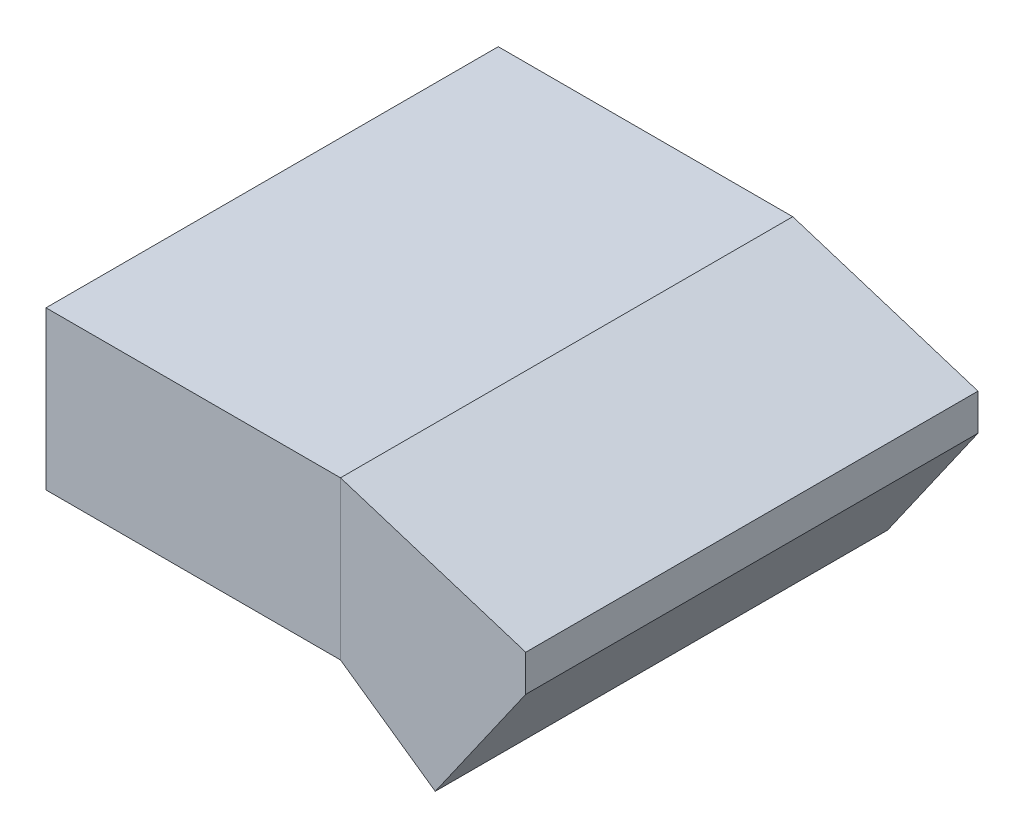
ISO-10303-21;
HEADER;
FILE_DESCRIPTION(('STEP AP214'),'2;1');
FILE_NAME('part.step','',(''),(''),'','','');
FILE_SCHEMA(('AUTOMOTIVE_DESIGN { 1 0 10303 214 1 1 1 1 }'));
ENDSEC;
DATA;
#1=APPLICATION_CONTEXT('core data for automotive mechanical design processes');
#2=APPLICATION_PROTOCOL_DEFINITION('international standard','automotive_design',2000,#1);
#3=PRODUCT_CONTEXT('',#1,'mechanical');
#4=PRODUCT('Part','Part','',(#3));
#5=PRODUCT_RELATED_PRODUCT_CATEGORY('part','',(#4));
#6=PRODUCT_DEFINITION_FORMATION('','',#4);
#7=PRODUCT_DEFINITION_CONTEXT('part definition',#1,'design');
#8=PRODUCT_DEFINITION('design','',#6,#7);
#9=PRODUCT_DEFINITION_SHAPE('','',#8);
#10=(LENGTH_UNIT() NAMED_UNIT(*) SI_UNIT(.MILLI.,.METRE.));
#11=(NAMED_UNIT(*) PLANE_ANGLE_UNIT() SI_UNIT($,.RADIAN.));
#12=(NAMED_UNIT(*) SI_UNIT($,.STERADIAN.) SOLID_ANGLE_UNIT());
#13=UNCERTAINTY_MEASURE_WITH_UNIT(LENGTH_MEASURE(1.E-05),#10,'distance_accuracy_value','');
#14=(GEOMETRIC_REPRESENTATION_CONTEXT(3) GLOBAL_UNCERTAINTY_ASSIGNED_CONTEXT((#13)) GLOBAL_UNIT_ASSIGNED_CONTEXT((#10,
#11,#12)) REPRESENTATION_CONTEXT('',''));
#15=CARTESIAN_POINT('',(0.,0.,0.));
#16=DIRECTION('',(0.,0.,1.));
#17=DIRECTION('',(1.,0.,0.));
#18=AXIS2_PLACEMENT_3D('',#15,#16,#17);
#19=CARTESIAN_POINT('',(3.9,3.,1.7));
#20=DIRECTION('',(0.,0.,1.));
#21=DIRECTION('',(1.,0.,0.));
#22=AXIS2_PLACEMENT_3D('',#19,#20,#21);
#23=PLANE('',#22);
#24=DIRECTION('',(0.,-1.,0.));
#25=VECTOR('',#24,1.);
#26=CARTESIAN_POINT('',(7.42286380648891,0.,1.7));
#27=LINE('',#26,#25);
#28=CARTESIAN_POINT('',(7.42286380648891,1.88924530842847,1.7));
#29=VERTEX_POINT('',#28);
#30=CARTESIAN_POINT('',(7.42286380648891,1.19558797289472,1.7));
#31=VERTEX_POINT('',#30);
#32=EDGE_CURVE('E124',#29,#31,#27,.T.);
#33=ORIENTED_EDGE('',*,*,#32,.F.);
#34=DIRECTION('',(-0.953716950748229,0.300705799504268,0.));
#35=VECTOR('',#34,1.);
#36=CARTESIAN_POINT('',(1.21301816816301,3.84720211731802,1.7));
#37=LINE('',#36,#35);
#38=CARTESIAN_POINT('',(3.9,3.,1.7));
#39=VERTEX_POINT('',#38);
#40=EDGE_CURVE('E134',#29,#39,#37,.T.);
#41=ORIENTED_EDGE('',*,*,#40,.T.);
#42=DIRECTION('',(0.,-1.,0.));
#43=VECTOR('',#42,1.);
#44=CARTESIAN_POINT('',(3.9,0.,1.7));
#45=LINE('',#44,#43);
#46=CARTESIAN_POINT('',(3.9,0.,1.7));
#47=VERTEX_POINT('',#46);
#48=EDGE_CURVE('E133',#39,#47,#45,.T.);
#49=ORIENTED_EDGE('',*,*,#48,.T.);
#50=DIRECTION('',(0.819152044288999,-0.573576436351037,0.));
#51=VECTOR('',#50,1.);
#52=CARTESIAN_POINT('',(1.2830607205149,1.83240061053251,1.7));
#53=LINE('',#52,#51);
#54=CARTESIAN_POINT('',(5.7021344974358,-1.26186815997228,1.7));
#55=VERTEX_POINT('',#54);
#56=EDGE_CURVE('E88',#47,#55,#53,.T.);
#57=ORIENTED_EDGE('',*,*,#56,.T.);
#58=DIRECTION('',(-0.573576436351036,-0.819152044288999,0.));
#59=VECTOR('',#58,1.);
#60=CARTESIAN_POINT('',(4.41907377692089,-3.09426877050478,1.7));
#61=LINE('',#60,#59);
#62=EDGE_CURVE('E93',#31,#55,#61,.T.);
#63=ORIENTED_EDGE('',*,*,#62,.F.);
#64=EDGE_LOOP('',(#33,#41,#49,#57,#63));
#65=FACE_BOUND('',#64,.T.);
#66=ADVANCED_FACE('F54',(#65),#23,.T.);
#67=CARTESIAN_POINT('',(0.,0.,-6.9));
#68=DIRECTION('',(0.,0.,-1.));
#69=DIRECTION('',(-1.,0.,0.));
#70=AXIS2_PLACEMENT_3D('',#67,#68,#69);
#71=PLANE('',#70);
#72=DIRECTION('',(-0.953716950748229,0.300705799504268,0.));
#73=VECTOR('',#72,1.);
#74=CARTESIAN_POINT('',(1.21301816816301,3.84720211731802,-6.9));
#75=LINE('',#74,#73);
#76=CARTESIAN_POINT('',(7.42286380648891,1.88924530842847,-6.9));
#77=VERTEX_POINT('',#76);
#78=CARTESIAN_POINT('',(3.9,3.,-6.9));
#79=VERTEX_POINT('',#78);
#80=EDGE_CURVE('E12',#77,#79,#75,.T.);
#81=ORIENTED_EDGE('',*,*,#80,.F.);
#82=DIRECTION('',(0.,-1.,0.));
#83=VECTOR('',#82,1.);
#84=CARTESIAN_POINT('',(7.42286380648891,0.,-6.9));
#85=LINE('',#84,#83);
#86=CARTESIAN_POINT('',(7.42286380648891,1.19558797289472,-6.9));
#87=VERTEX_POINT('',#86);
#88=EDGE_CURVE('E122',#77,#87,#85,.T.);
#89=ORIENTED_EDGE('',*,*,#88,.T.);
#90=DIRECTION('',(-0.573576436351036,-0.819152044288999,0.));
#91=VECTOR('',#90,1.);
#92=CARTESIAN_POINT('',(4.41907377692089,-3.09426877050479,-6.9));
#93=LINE('',#92,#91);
#94=CARTESIAN_POINT('',(5.7021344974358,-1.26186815997228,-6.9));
#95=VERTEX_POINT('',#94);
#96=EDGE_CURVE('E106',#87,#95,#93,.T.);
#97=ORIENTED_EDGE('',*,*,#96,.T.);
#98=DIRECTION('',(0.819152044288999,-0.573576436351036,0.));
#99=VECTOR('',#98,1.);
#100=CARTESIAN_POINT('',(1.2830607205149,1.83240061053251,-6.9));
#101=LINE('',#100,#99);
#102=CARTESIAN_POINT('',(3.9,0.,-6.9));
#103=VERTEX_POINT('',#102);
#104=EDGE_CURVE('E114',#103,#95,#101,.T.);
#105=ORIENTED_EDGE('',*,*,#104,.F.);
#106=DIRECTION('',(0.,-1.,0.));
#107=VECTOR('',#106,1.);
#108=CARTESIAN_POINT('',(3.9,0.,-6.9));
#109=LINE('',#108,#107);
#110=EDGE_CURVE('E138',#79,#103,#109,.T.);
#111=ORIENTED_EDGE('',*,*,#110,.F.);
#112=EDGE_LOOP('',(#81,#89,#97,#105,#111));
#113=FACE_BOUND('',#112,.T.);
#114=ADVANCED_FACE('F125',(#113),#71,.T.);
#115=CARTESIAN_POINT('',(7.42286380648891,0.,7.22938419826793));
#116=DIRECTION('',(1.,0.,0.));
#117=DIRECTION('',(0.,0.,-1.));
#118=AXIS2_PLACEMENT_3D('',#115,#116,#117);
#119=PLANE('',#118);
#120=DIRECTION('',(0.,0.,-1.));
#121=VECTOR('',#120,1.);
#122=CARTESIAN_POINT('',(7.42286380648891,1.88924530842847,7.22938419826793));
#123=LINE('',#122,#121);
#124=EDGE_CURVE('E59',#29,#77,#123,.T.);
#125=ORIENTED_EDGE('',*,*,#124,.F.);
#126=ORIENTED_EDGE('',*,*,#32,.T.);
#127=DIRECTION('',(0.,0.,-1.));
#128=VECTOR('',#127,1.);
#129=CARTESIAN_POINT('',(7.42286380648891,1.19558797289472,7.22938419826793));
#130=LINE('',#129,#128);
#131=EDGE_CURVE('E127',#31,#87,#130,.T.);
#132=ORIENTED_EDGE('',*,*,#131,.T.);
#133=ORIENTED_EDGE('',*,*,#88,.F.);
#134=EDGE_LOOP('',(#125,#126,#132,#133));
#135=FACE_BOUND('',#134,.T.);
#136=ADVANCED_FACE('F145',(#135),#119,.T.);
#137=CARTESIAN_POINT('',(4.41907377692089,-3.09426877050479,7.22938419826793));
#138=DIRECTION('',(0.819152044288999,-0.573576436351036,0.));
#139=DIRECTION('',(0.573576436351036,0.819152044288999,0.));
#140=AXIS2_PLACEMENT_3D('',#137,#138,#139);
#141=PLANE('',#140);
#142=ORIENTED_EDGE('',*,*,#131,.F.);
#143=ORIENTED_EDGE('',*,*,#62,.T.);
#144=DIRECTION('',(0.,0.,-1.));
#145=VECTOR('',#144,1.);
#146=CARTESIAN_POINT('',(5.7021344974358,-1.26186815997228,7.22938419826793));
#147=LINE('',#146,#145);
#148=EDGE_CURVE('E102',#55,#95,#147,.T.);
#149=ORIENTED_EDGE('',*,*,#148,.T.);
#150=ORIENTED_EDGE('',*,*,#96,.F.);
#151=EDGE_LOOP('',(#142,#143,#149,#150));
#152=FACE_BOUND('',#151,.T.);
#153=ADVANCED_FACE('F108',(#152),#141,.T.);
#154=CARTESIAN_POINT('',(1.2830607205149,1.83240061053251,7.22938419826793));
#155=DIRECTION('',(0.573576436351036,0.819152044288998,0.));
#156=DIRECTION('',(-0.819152044288999,0.573576436351037,0.));
#157=AXIS2_PLACEMENT_3D('',#154,#155,#156);
#158=PLANE('',#157);
#159=ORIENTED_EDGE('',*,*,#56,.F.);
#160=DIRECTION('',(0.,0.,-1.));
#161=VECTOR('',#160,1.);
#162=CARTESIAN_POINT('',(3.9,0.,7.22938419826793));
#163=LINE('',#162,#161);
#164=EDGE_CURVE('E113',#47,#103,#163,.T.);
#165=ORIENTED_EDGE('',*,*,#164,.T.);
#166=ORIENTED_EDGE('',*,*,#104,.T.);
#167=ORIENTED_EDGE('',*,*,#148,.F.);
#168=EDGE_LOOP('',(#159,#165,#166,#167));
#169=FACE_BOUND('',#168,.T.);
#170=ADVANCED_FACE('F112',(#169),#158,.F.);
#171=CARTESIAN_POINT('',(3.9,0.,7.22938419826793));
#172=DIRECTION('',(1.,0.,0.));
#173=DIRECTION('',(0.,0.,-1.));
#174=AXIS2_PLACEMENT_3D('',#171,#172,#173);
#175=PLANE('',#174);
#176=ORIENTED_EDGE('',*,*,#48,.F.);
#177=DIRECTION('',(0.,0.,-1.));
#178=VECTOR('',#177,1.);
#179=CARTESIAN_POINT('',(3.9,3.,7.22938419826793));
#180=LINE('',#179,#178);
#181=EDGE_CURVE('E119',#39,#79,#180,.T.);
#182=ORIENTED_EDGE('',*,*,#181,.T.);
#183=ORIENTED_EDGE('',*,*,#110,.T.);
#184=ORIENTED_EDGE('',*,*,#164,.F.);
#185=EDGE_LOOP('',(#176,#182,#183,#184));
#186=FACE_BOUND('',#185,.T.);
#187=ADVANCED_FACE('F150',(#186),#175,.F.);
#188=CARTESIAN_POINT('',(1.21301816816301,3.84720211731802,7.22938419826793));
#189=DIRECTION('',(-0.300705799504268,-0.953716950748229,0.));
#190=DIRECTION('',(0.953716950748229,-0.300705799504268,0.));
#191=AXIS2_PLACEMENT_3D('',#188,#189,#190);
#192=PLANE('',#191);
#193=ORIENTED_EDGE('',*,*,#40,.F.);
#194=ORIENTED_EDGE('',*,*,#124,.T.);
#195=ORIENTED_EDGE('',*,*,#80,.T.);
#196=ORIENTED_EDGE('',*,*,#181,.F.);
#197=EDGE_LOOP('',(#193,#194,#195,#196));
#198=FACE_BOUND('',#197,.T.);
#199=ADVANCED_FACE('F142',(#198),#192,.F.);
#200=CLOSED_SHELL('',(#66,#114,#136,#153,#170,#187,#199));
#201=MANIFOLD_SOLID_BREP('B2',#200);
#202=CARTESIAN_POINT('',(3.9,3.,-6.9));
#203=DIRECTION('',(0.,0.,1.));
#204=DIRECTION('',(1.,0.,0.));
#205=AXIS2_PLACEMENT_3D('',#202,#203,#204);
#206=PLANE('',#205);
#207=DIRECTION('',(-1.,0.,0.));
#208=VECTOR('',#207,1.);
#209=CARTESIAN_POINT('',(3.9,0.,-6.9));
#210=LINE('',#209,#208);
#211=CARTESIAN_POINT('',(3.9,0.,-6.9));
#212=VERTEX_POINT('',#211);
#213=CARTESIAN_POINT('',(-1.7,0.,-6.9));
#214=VERTEX_POINT('',#213);
#215=EDGE_CURVE('E287',#212,#214,#210,.T.);
#216=ORIENTED_EDGE('',*,*,#215,.T.);
#217=DIRECTION('',(0.,-1.,0.));
#218=VECTOR('',#217,1.);
#219=CARTESIAN_POINT('',(-1.7,3.,-6.9));
#220=LINE('',#219,#218);
#221=CARTESIAN_POINT('',(-1.7,3.,-6.9));
#222=VERTEX_POINT('',#221);
#223=EDGE_CURVE('E52',#222,#214,#220,.T.);
#224=ORIENTED_EDGE('',*,*,#223,.F.);
#225=DIRECTION('',(-1.,0.,0.));
#226=VECTOR('',#225,1.);
#227=CARTESIAN_POINT('',(3.9,3.,-6.9));
#228=LINE('',#227,#226);
#229=CARTESIAN_POINT('',(3.9,3.,-6.9));
#230=VERTEX_POINT('',#229);
#231=EDGE_CURVE('E270',#230,#222,#228,.T.);
#232=ORIENTED_EDGE('',*,*,#231,.F.);
#233=DIRECTION('',(0.,-1.,0.));
#234=VECTOR('',#233,1.);
#235=CARTESIAN_POINT('',(3.9,3.,-6.9));
#236=LINE('',#235,#234);
#237=EDGE_CURVE('E285',#230,#212,#236,.T.);
#238=ORIENTED_EDGE('',*,*,#237,.T.);
#239=EDGE_LOOP('',(#216,#224,#232,#238));
#240=FACE_BOUND('',#239,.T.);
#241=ADVANCED_FACE('F220',(#240),#206,.F.);
#242=CARTESIAN_POINT('',(-1.7,3.,-6.9));
#243=DIRECTION('',(1.,0.,0.));
#244=DIRECTION('',(0.,0.,-1.));
#245=AXIS2_PLACEMENT_3D('',#242,#243,#244);
#246=PLANE('',#245);
#247=DIRECTION('',(0.,0.,1.));
#248=VECTOR('',#247,1.);
#249=CARTESIAN_POINT('',(-1.7,0.,-6.9));
#250=LINE('',#249,#248);
#251=CARTESIAN_POINT('',(-1.7,0.,1.7));
#252=VERTEX_POINT('',#251);
#253=EDGE_CURVE('E273',#214,#252,#250,.T.);
#254=ORIENTED_EDGE('',*,*,#253,.T.);
#255=DIRECTION('',(0.,-1.,0.));
#256=VECTOR('',#255,1.);
#257=CARTESIAN_POINT('',(-1.7,3.,1.7));
#258=LINE('',#257,#256);
#259=CARTESIAN_POINT('',(-1.7,3.,1.7));
#260=VERTEX_POINT('',#259);
#261=EDGE_CURVE('E226',#260,#252,#258,.T.);
#262=ORIENTED_EDGE('',*,*,#261,.F.);
#263=DIRECTION('',(0.,0.,1.));
#264=VECTOR('',#263,1.);
#265=CARTESIAN_POINT('',(-1.7,3.,-6.9));
#266=LINE('',#265,#264);
#267=EDGE_CURVE('E265',#222,#260,#266,.T.);
#268=ORIENTED_EDGE('',*,*,#267,.F.);
#269=ORIENTED_EDGE('',*,*,#223,.T.);
#270=EDGE_LOOP('',(#254,#262,#268,#269));
#271=FACE_BOUND('',#270,.T.);
#272=ADVANCED_FACE('F275',(#271),#246,.F.);
#273=CARTESIAN_POINT('',(3.9,3.,1.7));
#274=DIRECTION('',(0.,0.,1.));
#275=DIRECTION('',(1.,0.,0.));
#276=AXIS2_PLACEMENT_3D('',#273,#274,#275);
#277=PLANE('',#276);
#278=DIRECTION('',(-1.,0.,0.));
#279=VECTOR('',#278,1.);
#280=CARTESIAN_POINT('',(3.9,0.,1.7));
#281=LINE('',#280,#279);
#282=CARTESIAN_POINT('',(3.9,0.,1.7));
#283=VERTEX_POINT('',#282);
#284=EDGE_CURVE('E295',#283,#252,#281,.T.);
#285=ORIENTED_EDGE('',*,*,#284,.F.);
#286=DIRECTION('',(0.,-1.,0.));
#287=VECTOR('',#286,1.);
#288=CARTESIAN_POINT('',(3.9,3.,1.7));
#289=LINE('',#288,#287);
#290=CARTESIAN_POINT('',(3.9,3.,1.7));
#291=VERTEX_POINT('',#290);
#292=EDGE_CURVE('E280',#291,#283,#289,.T.);
#293=ORIENTED_EDGE('',*,*,#292,.F.);
#294=DIRECTION('',(-1.,0.,0.));
#295=VECTOR('',#294,1.);
#296=CARTESIAN_POINT('',(3.9,3.,1.7));
#297=LINE('',#296,#295);
#298=EDGE_CURVE('E262',#291,#260,#297,.T.);
#299=ORIENTED_EDGE('',*,*,#298,.T.);
#300=ORIENTED_EDGE('',*,*,#261,.T.);
#301=EDGE_LOOP('',(#285,#293,#299,#300));
#302=FACE_BOUND('',#301,.T.);
#303=ADVANCED_FACE('F277',(#302),#277,.T.);
#304=CARTESIAN_POINT('',(3.9,3.,-5.2));
#305=DIRECTION('',(-1.,0.,0.));
#306=DIRECTION('',(0.,0.,1.));
#307=AXIS2_PLACEMENT_3D('',#304,#305,#306);
#308=PLANE('',#307);
#309=DIRECTION('',(0.,0.,-1.));
#310=VECTOR('',#309,1.);
#311=CARTESIAN_POINT('',(3.9,0.,-5.2));
#312=LINE('',#311,#310);
#313=EDGE_CURVE('E255',#283,#212,#312,.T.);
#314=ORIENTED_EDGE('',*,*,#313,.T.);
#315=ORIENTED_EDGE('',*,*,#237,.F.);
#316=DIRECTION('',(0.,0.,1.));
#317=VECTOR('',#316,1.);
#318=CARTESIAN_POINT('',(3.9,3.,-5.2));
#319=LINE('',#318,#317);
#320=EDGE_CURVE('E234',#230,#291,#319,.T.);
#321=ORIENTED_EDGE('',*,*,#320,.T.);
#322=ORIENTED_EDGE('',*,*,#292,.T.);
#323=EDGE_LOOP('',(#314,#315,#321,#322));
#324=FACE_BOUND('',#323,.T.);
#325=ADVANCED_FACE('F299',(#324),#308,.F.);
#326=CARTESIAN_POINT('',(0.,3.,0.));
#327=DIRECTION('',(0.,1.,0.));
#328=DIRECTION('',(0.,0.,1.));
#329=AXIS2_PLACEMENT_3D('',#326,#327,#328);
#330=PLANE('',#329);
#331=ORIENTED_EDGE('',*,*,#231,.T.);
#332=ORIENTED_EDGE('',*,*,#267,.T.);
#333=ORIENTED_EDGE('',*,*,#298,.F.);
#334=ORIENTED_EDGE('',*,*,#320,.F.);
#335=EDGE_LOOP('',(#331,#332,#333,#334));
#336=FACE_BOUND('',#335,.T.);
#337=ADVANCED_FACE('F261',(#336),#330,.T.);
#338=CARTESIAN_POINT('',(0.,0.,0.));
#339=DIRECTION('',(0.,1.,0.));
#340=DIRECTION('',(0.,0.,1.));
#341=AXIS2_PLACEMENT_3D('',#338,#339,#340);
#342=PLANE('',#341);
#343=ORIENTED_EDGE('',*,*,#215,.F.);
#344=ORIENTED_EDGE('',*,*,#313,.F.);
#345=ORIENTED_EDGE('',*,*,#284,.T.);
#346=ORIENTED_EDGE('',*,*,#253,.F.);
#347=EDGE_LOOP('',(#343,#344,#345,#346));
#348=FACE_BOUND('',#347,.T.);
#349=ADVANCED_FACE('F301',(#348),#342,.F.);
#350=CLOSED_SHELL('',(#241,#272,#303,#325,#337,#349));
#351=MANIFOLD_SOLID_BREP('B6',#350);
#352=ADVANCED_BREP_SHAPE_REPRESENTATION('',(#18,#201,#351),#14);
#353=SHAPE_DEFINITION_REPRESENTATION(#9,#352);
ENDSEC;
END-ISO-10303-21;
